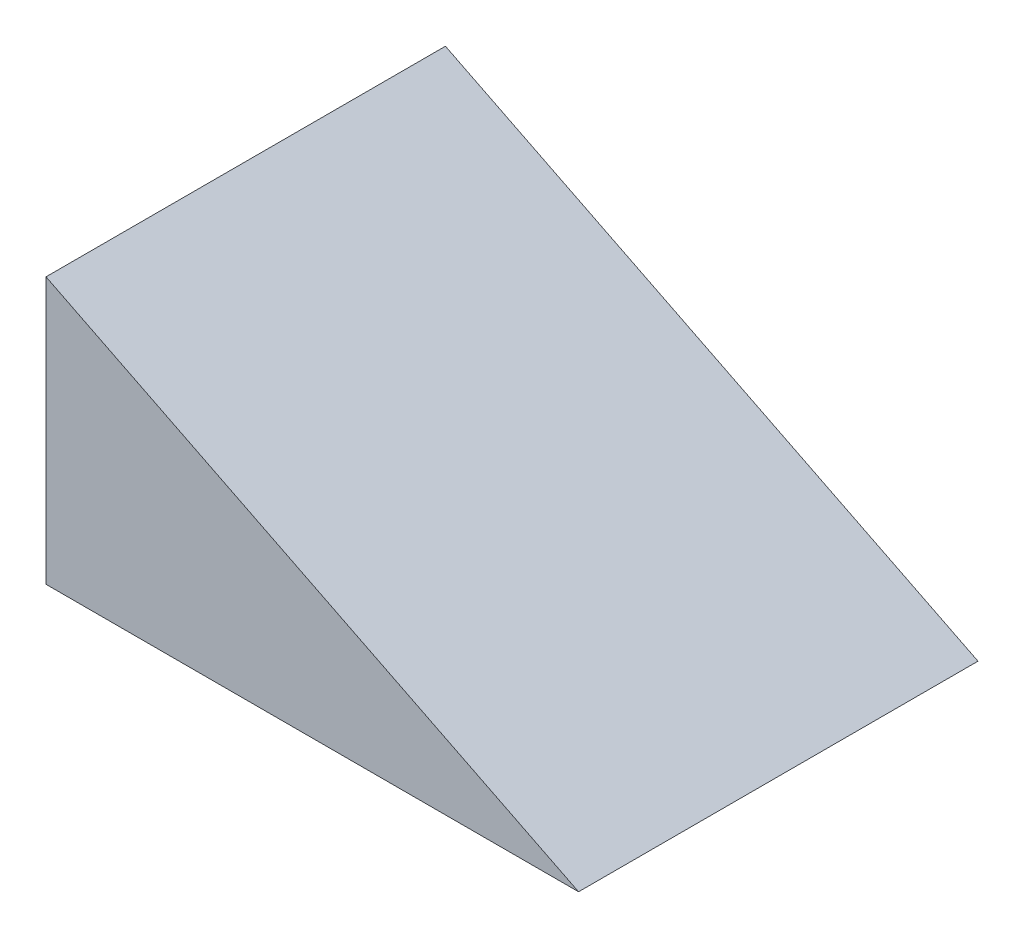
ISO-10303-21;
HEADER;
FILE_DESCRIPTION(('STEP AP214'),'2;1');
FILE_NAME('part.step','',(''),(''),'','','');
FILE_SCHEMA(('AUTOMOTIVE_DESIGN { 1 0 10303 214 1 1 1 1 }'));
ENDSEC;
DATA;
#1=APPLICATION_CONTEXT('core data for automotive mechanical design processes');
#2=APPLICATION_PROTOCOL_DEFINITION('international standard','automotive_design',2000,#1);
#3=PRODUCT_CONTEXT('',#1,'mechanical');
#4=PRODUCT('Part','Part','',(#3));
#5=PRODUCT_RELATED_PRODUCT_CATEGORY('part','',(#4));
#6=PRODUCT_DEFINITION_FORMATION('','',#4);
#7=PRODUCT_DEFINITION_CONTEXT('part definition',#1,'design');
#8=PRODUCT_DEFINITION('design','',#6,#7);
#9=PRODUCT_DEFINITION_SHAPE('','',#8);
#10=(LENGTH_UNIT() NAMED_UNIT(*) SI_UNIT(.MILLI.,.METRE.));
#11=(NAMED_UNIT(*) PLANE_ANGLE_UNIT() SI_UNIT($,.RADIAN.));
#12=(NAMED_UNIT(*) SI_UNIT($,.STERADIAN.) SOLID_ANGLE_UNIT());
#13=UNCERTAINTY_MEASURE_WITH_UNIT(LENGTH_MEASURE(1.E-05),#10,'distance_accuracy_value','');
#14=(GEOMETRIC_REPRESENTATION_CONTEXT(3) GLOBAL_UNCERTAINTY_ASSIGNED_CONTEXT((#13)) GLOBAL_UNIT_ASSIGNED_CONTEXT((#10,
#11,#12)) REPRESENTATION_CONTEXT('',''));
#15=CARTESIAN_POINT('',(0.,0.,0.));
#16=DIRECTION('',(0.,0.,1.));
#17=DIRECTION('',(1.,0.,0.));
#18=AXIS2_PLACEMENT_3D('',#15,#16,#17);
#19=CARTESIAN_POINT('',(50.8,0.,-38.1));
#20=DIRECTION('',(0.,-1.,0.));
#21=DIRECTION('',(0.,0.,-1.));
#22=AXIS2_PLACEMENT_3D('',#19,#20,#21);
#23=PLANE('',#22);
#24=DIRECTION('',(1.,0.,0.));
#25=VECTOR('',#24,1.);
#26=CARTESIAN_POINT('',(50.8,0.,0.));
#27=LINE('',#26,#25);
#28=CARTESIAN_POINT('',(0.,0.,0.));
#29=VERTEX_POINT('',#28);
#30=CARTESIAN_POINT('',(50.8,0.,0.));
#31=VERTEX_POINT('',#30);
#32=EDGE_CURVE('E103',#29,#31,#27,.T.);
#33=ORIENTED_EDGE('',*,*,#32,.F.);
#34=DIRECTION('',(0.,0.,1.));
#35=VECTOR('',#34,1.);
#36=CARTESIAN_POINT('',(0.,0.,-38.1));
#37=LINE('',#36,#35);
#38=CARTESIAN_POINT('',(0.,0.,-38.1));
#39=VERTEX_POINT('',#38);
#40=EDGE_CURVE('E11',#39,#29,#37,.T.);
#41=ORIENTED_EDGE('',*,*,#40,.F.);
#42=DIRECTION('',(1.,0.,0.));
#43=VECTOR('',#42,1.);
#44=CARTESIAN_POINT('',(50.8,0.,-38.1));
#45=LINE('',#44,#43);
#46=CARTESIAN_POINT('',(50.8,0.,-38.1));
#47=VERTEX_POINT('',#46);
#48=EDGE_CURVE('E91',#39,#47,#45,.T.);
#49=ORIENTED_EDGE('',*,*,#48,.T.);
#50=DIRECTION('',(0.,0.,1.));
#51=VECTOR('',#50,1.);
#52=CARTESIAN_POINT('',(50.8,0.,-38.1));
#53=LINE('',#52,#51);
#54=EDGE_CURVE('E48',#47,#31,#53,.T.);
#55=ORIENTED_EDGE('',*,*,#54,.T.);
#56=EDGE_LOOP('',(#33,#41,#49,#55));
#57=FACE_BOUND('',#56,.T.);
#58=ADVANCED_FACE('F45',(#57),#23,.T.);
#59=CARTESIAN_POINT('',(0.,0.,-38.1));
#60=DIRECTION('',(-1.,0.,0.));
#61=DIRECTION('',(0.,0.,1.));
#62=AXIS2_PLACEMENT_3D('',#59,#60,#61);
#63=PLANE('',#62);
#64=DIRECTION('',(0.,-1.,0.));
#65=VECTOR('',#64,1.);
#66=CARTESIAN_POINT('',(0.,0.,0.));
#67=LINE('',#66,#65);
#68=CARTESIAN_POINT('',(0.,25.4,0.));
#69=VERTEX_POINT('',#68);
#70=EDGE_CURVE('E95',#69,#29,#67,.T.);
#71=ORIENTED_EDGE('',*,*,#70,.F.);
#72=DIRECTION('',(0.,0.,1.));
#73=VECTOR('',#72,1.);
#74=CARTESIAN_POINT('',(0.,25.4,-38.1));
#75=LINE('',#74,#73);
#76=CARTESIAN_POINT('',(0.,25.4,-38.1));
#77=VERTEX_POINT('',#76);
#78=EDGE_CURVE('E55',#77,#69,#75,.T.);
#79=ORIENTED_EDGE('',*,*,#78,.F.);
#80=DIRECTION('',(0.,-1.,0.));
#81=VECTOR('',#80,1.);
#82=CARTESIAN_POINT('',(0.,0.,-38.1));
#83=LINE('',#82,#81);
#84=EDGE_CURVE('E88',#77,#39,#83,.T.);
#85=ORIENTED_EDGE('',*,*,#84,.T.);
#86=ORIENTED_EDGE('',*,*,#40,.T.);
#87=EDGE_LOOP('',(#71,#79,#85,#86));
#88=FACE_BOUND('',#87,.T.);
#89=ADVANCED_FACE('F110',(#88),#63,.T.);
#90=CARTESIAN_POINT('',(0.,25.4,-38.1));
#91=DIRECTION('',(0.447213595499958,0.894427190999916,0.));
#92=DIRECTION('',(-0.894427190999916,0.447213595499958,0.));
#93=AXIS2_PLACEMENT_3D('',#90,#91,#92);
#94=PLANE('',#93);
#95=DIRECTION('',(-0.894427190999916,0.447213595499958,0.));
#96=VECTOR('',#95,1.);
#97=CARTESIAN_POINT('',(0.,25.4,0.));
#98=LINE('',#97,#96);
#99=EDGE_CURVE('E85',#31,#69,#98,.T.);
#100=ORIENTED_EDGE('',*,*,#99,.F.);
#101=ORIENTED_EDGE('',*,*,#54,.F.);
#102=DIRECTION('',(-0.894427190999916,0.447213595499958,0.));
#103=VECTOR('',#102,1.);
#104=CARTESIAN_POINT('',(0.,25.4,-38.1));
#105=LINE('',#104,#103);
#106=EDGE_CURVE('E83',#47,#77,#105,.T.);
#107=ORIENTED_EDGE('',*,*,#106,.T.);
#108=ORIENTED_EDGE('',*,*,#78,.T.);
#109=EDGE_LOOP('',(#100,#101,#107,#108));
#110=FACE_BOUND('',#109,.T.);
#111=ADVANCED_FACE('F82',(#110),#94,.T.);
#112=CARTESIAN_POINT('',(0.,0.,-38.1));
#113=DIRECTION('',(0.,0.,-1.));
#114=DIRECTION('',(-1.,0.,0.));
#115=AXIS2_PLACEMENT_3D('',#112,#113,#114);
#116=PLANE('',#115);
#117=ORIENTED_EDGE('',*,*,#48,.F.);
#118=ORIENTED_EDGE('',*,*,#84,.F.);
#119=ORIENTED_EDGE('',*,*,#106,.F.);
#120=EDGE_LOOP('',(#117,#118,#119));
#121=FACE_BOUND('',#120,.T.);
#122=ADVANCED_FACE('F90',(#121),#116,.T.);
#123=CARTESIAN_POINT('',(0.,0.,0.));
#124=DIRECTION('',(0.,0.,-1.));
#125=DIRECTION('',(-1.,0.,0.));
#126=AXIS2_PLACEMENT_3D('',#123,#124,#125);
#127=PLANE('',#126);
#128=ORIENTED_EDGE('',*,*,#32,.T.);
#129=ORIENTED_EDGE('',*,*,#99,.T.);
#130=ORIENTED_EDGE('',*,*,#70,.T.);
#131=EDGE_LOOP('',(#128,#129,#130));
#132=FACE_BOUND('',#131,.T.);
#133=ADVANCED_FACE('F109',(#132),#127,.F.);
#134=CLOSED_SHELL('',(#58,#89,#111,#122,#133));
#135=MANIFOLD_SOLID_BREP('B2',#134);
#136=ADVANCED_BREP_SHAPE_REPRESENTATION('',(#18,#135),#14);
#137=SHAPE_DEFINITION_REPRESENTATION(#9,#136);
ENDSEC;
END-ISO-10303-21;
